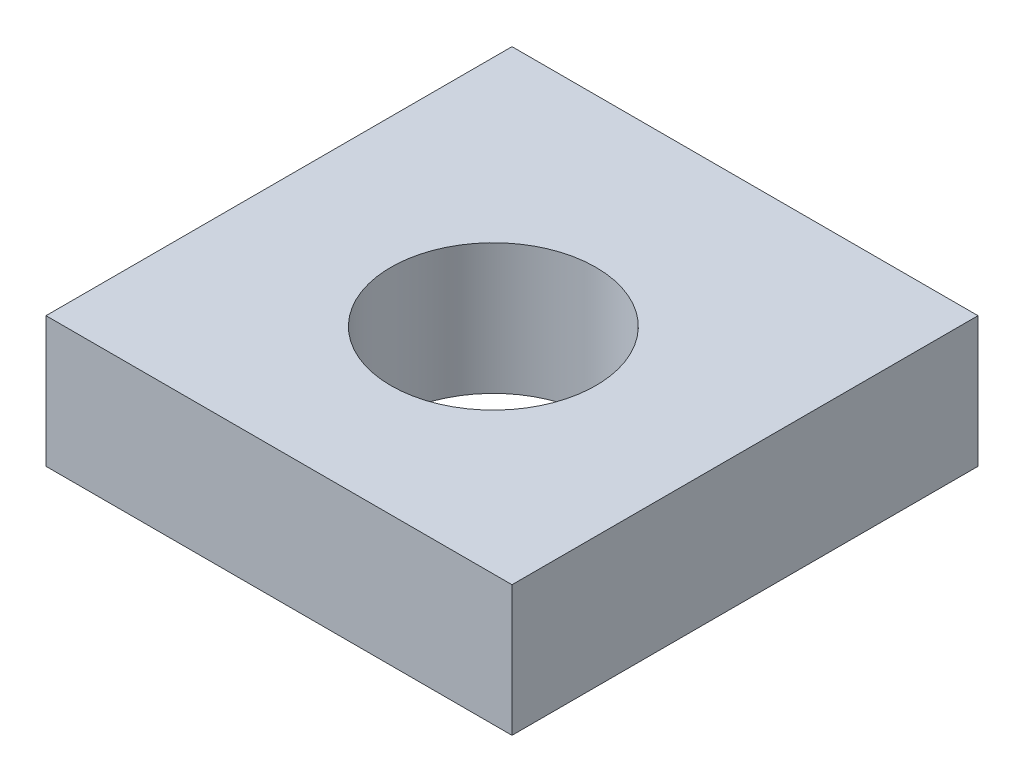
ISO-10303-21;
HEADER;
FILE_DESCRIPTION(('STEP AP214'),'2;1');
FILE_NAME('part.step','',(''),(''),'','','');
FILE_SCHEMA(('AUTOMOTIVE_DESIGN { 1 0 10303 214 1 1 1 1 }'));
ENDSEC;
DATA;
#1=APPLICATION_CONTEXT('core data for automotive mechanical design processes');
#2=APPLICATION_PROTOCOL_DEFINITION('international standard','automotive_design',2000,#1);
#3=PRODUCT_CONTEXT('',#1,'mechanical');
#4=PRODUCT('Part','Part','',(#3));
#5=PRODUCT_RELATED_PRODUCT_CATEGORY('part','',(#4));
#6=PRODUCT_DEFINITION_FORMATION('','',#4);
#7=PRODUCT_DEFINITION_CONTEXT('part definition',#1,'design');
#8=PRODUCT_DEFINITION('design','',#6,#7);
#9=PRODUCT_DEFINITION_SHAPE('','',#8);
#10=(LENGTH_UNIT() NAMED_UNIT(*) SI_UNIT(.MILLI.,.METRE.));
#11=(NAMED_UNIT(*) PLANE_ANGLE_UNIT() SI_UNIT($,.RADIAN.));
#12=(NAMED_UNIT(*) SI_UNIT($,.STERADIAN.) SOLID_ANGLE_UNIT());
#13=UNCERTAINTY_MEASURE_WITH_UNIT(LENGTH_MEASURE(1.E-05),#10,'distance_accuracy_value','');
#14=(GEOMETRIC_REPRESENTATION_CONTEXT(3) GLOBAL_UNCERTAINTY_ASSIGNED_CONTEXT((#13)) GLOBAL_UNIT_ASSIGNED_CONTEXT((#10,
#11,#12)) REPRESENTATION_CONTEXT('',''));
#15=CARTESIAN_POINT('',(0.,0.,0.));
#16=DIRECTION('',(0.,0.,1.));
#17=DIRECTION('',(1.,0.,0.));
#18=AXIS2_PLACEMENT_3D('',#15,#16,#17);
#19=CARTESIAN_POINT('',(275.,492.,130.));
#20=DIRECTION('',(1.,0.,0.));
#21=DIRECTION('',(0.,0.,-1.));
#22=AXIS2_PLACEMENT_3D('',#19,#20,#21);
#23=PLANE('',#22);
#24=DIRECTION('',(0.,0.,1.));
#25=VECTOR('',#24,1.);
#26=CARTESIAN_POINT('',(275.,478.,130.));
#27=LINE('',#26,#25);
#28=CARTESIAN_POINT('',(275.,478.,130.));
#29=VERTEX_POINT('',#28);
#30=CARTESIAN_POINT('',(275.,478.,180.));
#31=VERTEX_POINT('',#30);
#32=EDGE_CURVE('E101',#29,#31,#27,.T.);
#33=ORIENTED_EDGE('',*,*,#32,.T.);
#34=DIRECTION('',(0.,-1.,0.));
#35=VECTOR('',#34,1.);
#36=CARTESIAN_POINT('',(275.,492.,180.));
#37=LINE('',#36,#35);
#38=CARTESIAN_POINT('',(275.,492.,180.));
#39=VERTEX_POINT('',#38);
#40=EDGE_CURVE('E11',#39,#31,#37,.T.);
#41=ORIENTED_EDGE('',*,*,#40,.F.);
#42=DIRECTION('',(0.,0.,1.));
#43=VECTOR('',#42,1.);
#44=CARTESIAN_POINT('',(275.,492.,130.));
#45=LINE('',#44,#43);
#46=CARTESIAN_POINT('',(275.,492.,130.));
#47=VERTEX_POINT('',#46);
#48=EDGE_CURVE('E91',#47,#39,#45,.T.);
#49=ORIENTED_EDGE('',*,*,#48,.F.);
#50=DIRECTION('',(0.,-1.,0.));
#51=VECTOR('',#50,1.);
#52=CARTESIAN_POINT('',(275.,492.,130.));
#53=LINE('',#52,#51);
#54=EDGE_CURVE('E99',#47,#29,#53,.T.);
#55=ORIENTED_EDGE('',*,*,#54,.T.);
#56=EDGE_LOOP('',(#33,#41,#49,#55));
#57=FACE_BOUND('',#56,.T.);
#58=ADVANCED_FACE('F39',(#57),#23,.F.);
#59=CARTESIAN_POINT('',(275.,492.,180.));
#60=DIRECTION('',(0.,0.,-1.));
#61=DIRECTION('',(-1.,0.,0.));
#62=AXIS2_PLACEMENT_3D('',#59,#60,#61);
#63=PLANE('',#62);
#64=DIRECTION('',(1.,0.,0.));
#65=VECTOR('',#64,1.);
#66=CARTESIAN_POINT('',(275.,478.,180.));
#67=LINE('',#66,#65);
#68=CARTESIAN_POINT('',(325.,478.,180.));
#69=VERTEX_POINT('',#68);
#70=EDGE_CURVE('E94',#31,#69,#67,.T.);
#71=ORIENTED_EDGE('',*,*,#70,.T.);
#72=DIRECTION('',(0.,-1.,0.));
#73=VECTOR('',#72,1.);
#74=CARTESIAN_POINT('',(325.,492.,180.));
#75=LINE('',#74,#73);
#76=CARTESIAN_POINT('',(325.,492.,180.));
#77=VERTEX_POINT('',#76);
#78=EDGE_CURVE('E48',#77,#69,#75,.T.);
#79=ORIENTED_EDGE('',*,*,#78,.F.);
#80=DIRECTION('',(1.,0.,0.));
#81=VECTOR('',#80,1.);
#82=CARTESIAN_POINT('',(275.,492.,180.));
#83=LINE('',#82,#81);
#84=EDGE_CURVE('E86',#39,#77,#83,.T.);
#85=ORIENTED_EDGE('',*,*,#84,.F.);
#86=ORIENTED_EDGE('',*,*,#40,.T.);
#87=EDGE_LOOP('',(#71,#79,#85,#86));
#88=FACE_BOUND('',#87,.T.);
#89=ADVANCED_FACE('F92',(#88),#63,.F.);
#90=CARTESIAN_POINT('',(325.,492.,130.));
#91=DIRECTION('',(-1.,0.,0.));
#92=DIRECTION('',(0.,0.,1.));
#93=AXIS2_PLACEMENT_3D('',#90,#91,#92);
#94=PLANE('',#93);
#95=DIRECTION('',(0.,0.,-1.));
#96=VECTOR('',#95,1.);
#97=CARTESIAN_POINT('',(325.,478.,130.));
#98=LINE('',#97,#96);
#99=CARTESIAN_POINT('',(325.,478.,130.));
#100=VERTEX_POINT('',#99);
#101=EDGE_CURVE('E71',#69,#100,#98,.T.);
#102=ORIENTED_EDGE('',*,*,#101,.T.);
#103=DIRECTION('',(0.,-1.,0.));
#104=VECTOR('',#103,1.);
#105=CARTESIAN_POINT('',(325.,492.,130.));
#106=LINE('',#105,#104);
#107=CARTESIAN_POINT('',(325.,492.,130.));
#108=VERTEX_POINT('',#107);
#109=EDGE_CURVE('E96',#108,#100,#106,.T.);
#110=ORIENTED_EDGE('',*,*,#109,.F.);
#111=DIRECTION('',(0.,0.,-1.));
#112=VECTOR('',#111,1.);
#113=CARTESIAN_POINT('',(325.,492.,130.));
#114=LINE('',#113,#112);
#115=EDGE_CURVE('E87',#77,#108,#114,.T.);
#116=ORIENTED_EDGE('',*,*,#115,.F.);
#117=ORIENTED_EDGE('',*,*,#78,.T.);
#118=EDGE_LOOP('',(#102,#110,#116,#117));
#119=FACE_BOUND('',#118,.T.);
#120=ADVANCED_FACE('F97',(#119),#94,.F.);
#121=CARTESIAN_POINT('',(275.,492.,130.));
#122=DIRECTION('',(0.,0.,1.));
#123=DIRECTION('',(1.,0.,0.));
#124=AXIS2_PLACEMENT_3D('',#121,#122,#123);
#125=PLANE('',#124);
#126=DIRECTION('',(-1.,0.,0.));
#127=VECTOR('',#126,1.);
#128=CARTESIAN_POINT('',(275.,478.,130.));
#129=LINE('',#128,#127);
#130=EDGE_CURVE('E80',#100,#29,#129,.T.);
#131=ORIENTED_EDGE('',*,*,#130,.T.);
#132=ORIENTED_EDGE('',*,*,#54,.F.);
#133=DIRECTION('',(-1.,0.,0.));
#134=VECTOR('',#133,1.);
#135=CARTESIAN_POINT('',(275.,492.,130.));
#136=LINE('',#135,#134);
#137=EDGE_CURVE('E57',#108,#47,#136,.T.);
#138=ORIENTED_EDGE('',*,*,#137,.F.);
#139=ORIENTED_EDGE('',*,*,#109,.T.);
#140=EDGE_LOOP('',(#131,#132,#138,#139));
#141=FACE_BOUND('',#140,.T.);
#142=ADVANCED_FACE('F112',(#141),#125,.F.);
#143=CARTESIAN_POINT('',(0.,492.,0.));
#144=DIRECTION('',(0.,1.,0.));
#145=DIRECTION('',(0.,0.,1.));
#146=AXIS2_PLACEMENT_3D('',#143,#144,#145);
#147=PLANE('',#146);
#148=CARTESIAN_POINT('',(300.,492.,157.));
#149=DIRECTION('',(0.,1.,0.));
#150=DIRECTION('',(0.,0.,1.));
#151=AXIS2_PLACEMENT_3D('',#148,#149,#150);
#152=CIRCLE('',#151,11.);
#153=CARTESIAN_POINT('',(300.,492.,168.));
#154=VERTEX_POINT('',#153);
#155=EDGE_CURVE('E120',#154,#154,#152,.T.);
#156=ORIENTED_EDGE('',*,*,#155,.F.);
#157=EDGE_LOOP('',(#156));
#158=FACE_BOUND('',#157,.T.);
#159=ORIENTED_EDGE('',*,*,#48,.T.);
#160=ORIENTED_EDGE('',*,*,#84,.T.);
#161=ORIENTED_EDGE('',*,*,#115,.T.);
#162=ORIENTED_EDGE('',*,*,#137,.T.);
#163=EDGE_LOOP('',(#159,#160,#161,#162));
#164=FACE_BOUND('',#163,.T.);
#165=ADVANCED_FACE('F90',(#158,#164),#147,.T.);
#166=CARTESIAN_POINT('',(0.,478.,0.));
#167=DIRECTION('',(0.,1.,0.));
#168=DIRECTION('',(0.,0.,1.));
#169=AXIS2_PLACEMENT_3D('',#166,#167,#168);
#170=PLANE('',#169);
#171=CARTESIAN_POINT('',(300.,478.,157.));
#172=DIRECTION('',(0.,1.,0.));
#173=DIRECTION('',(0.,0.,1.));
#174=AXIS2_PLACEMENT_3D('',#171,#172,#173);
#175=CIRCLE('',#174,11.);
#176=CARTESIAN_POINT('',(300.,478.,168.));
#177=VERTEX_POINT('',#176);
#178=EDGE_CURVE('E45',#177,#177,#175,.T.);
#179=ORIENTED_EDGE('',*,*,#178,.T.);
#180=EDGE_LOOP('',(#179));
#181=FACE_BOUND('',#180,.T.);
#182=ORIENTED_EDGE('',*,*,#32,.F.);
#183=ORIENTED_EDGE('',*,*,#130,.F.);
#184=ORIENTED_EDGE('',*,*,#101,.F.);
#185=ORIENTED_EDGE('',*,*,#70,.F.);
#186=EDGE_LOOP('',(#182,#183,#184,#185));
#187=FACE_BOUND('',#186,.T.);
#188=ADVANCED_FACE('F114',(#181,#187),#170,.F.);
#189=CARTESIAN_POINT('',(300.,458.,157.));
#190=DIRECTION('',(0.,1.,0.));
#191=DIRECTION('',(0.,0.,1.));
#192=AXIS2_PLACEMENT_3D('',#189,#190,#191);
#193=CYLINDRICAL_SURFACE('',#192,11.);
#194=ORIENTED_EDGE('',*,*,#155,.T.);
#195=EDGE_LOOP('',(#194));
#196=FACE_BOUND('',#195,.T.);
#197=ORIENTED_EDGE('',*,*,#178,.F.);
#198=EDGE_LOOP('',(#197));
#199=FACE_BOUND('',#198,.T.);
#200=ADVANCED_FACE('F124',(#196,#199),#193,.F.);
#201=CLOSED_SHELL('',(#58,#89,#120,#142,#165,#188,#200));
#202=MANIFOLD_SOLID_BREP('B2',#201);
#203=ADVANCED_BREP_SHAPE_REPRESENTATION('',(#18,#202),#14);
#204=SHAPE_DEFINITION_REPRESENTATION(#9,#203);
ENDSEC;
END-ISO-10303-21;
